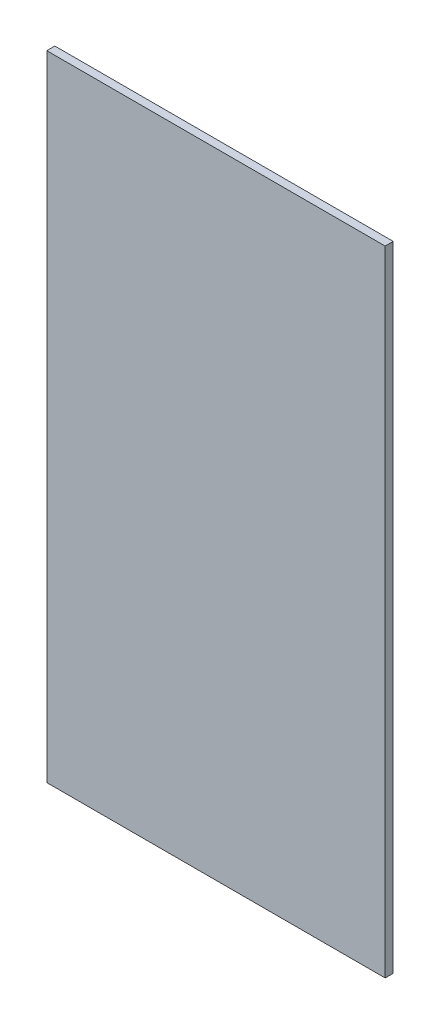
ISO-10303-21;
HEADER;
FILE_DESCRIPTION(('STEP AP214'),'2;1');
FILE_NAME('part.step','',(''),(''),'','','');
FILE_SCHEMA(('AUTOMOTIVE_DESIGN { 1 0 10303 214 1 1 1 1 }'));
ENDSEC;
DATA;
#1=APPLICATION_CONTEXT('core data for automotive mechanical design processes');
#2=APPLICATION_PROTOCOL_DEFINITION('international standard','automotive_design',2000,#1);
#3=PRODUCT_CONTEXT('',#1,'mechanical');
#4=PRODUCT('Part','Part','',(#3));
#5=PRODUCT_RELATED_PRODUCT_CATEGORY('part','',(#4));
#6=PRODUCT_DEFINITION_FORMATION('','',#4);
#7=PRODUCT_DEFINITION_CONTEXT('part definition',#1,'design');
#8=PRODUCT_DEFINITION('design','',#6,#7);
#9=PRODUCT_DEFINITION_SHAPE('','',#8);
#10=(LENGTH_UNIT() NAMED_UNIT(*) SI_UNIT(.MILLI.,.METRE.));
#11=(NAMED_UNIT(*) PLANE_ANGLE_UNIT() SI_UNIT($,.RADIAN.));
#12=(NAMED_UNIT(*) SI_UNIT($,.STERADIAN.) SOLID_ANGLE_UNIT());
#13=UNCERTAINTY_MEASURE_WITH_UNIT(LENGTH_MEASURE(1.E-05),#10,'distance_accuracy_value','');
#14=(GEOMETRIC_REPRESENTATION_CONTEXT(3) GLOBAL_UNCERTAINTY_ASSIGNED_CONTEXT((#13)) GLOBAL_UNIT_ASSIGNED_CONTEXT((#10,
#11,#12)) REPRESENTATION_CONTEXT('',''));
#15=CARTESIAN_POINT('',(0.,0.,0.));
#16=DIRECTION('',(0.,0.,1.));
#17=DIRECTION('',(1.,0.,0.));
#18=AXIS2_PLACEMENT_3D('',#15,#16,#17);
#19=CARTESIAN_POINT('',(61.5,116.5,1.5));
#20=DIRECTION('',(-1.,0.,0.));
#21=DIRECTION('',(0.,0.,1.));
#22=AXIS2_PLACEMENT_3D('',#19,#20,#21);
#23=PLANE('',#22);
#24=DIRECTION('',(0.,1.,0.));
#25=VECTOR('',#24,1.);
#26=CARTESIAN_POINT('',(61.5,116.5,0.));
#27=LINE('',#26,#25);
#28=CARTESIAN_POINT('',(61.5,-1.5,0.));
#29=VERTEX_POINT('',#28);
#30=CARTESIAN_POINT('',(61.5,116.5,0.));
#31=VERTEX_POINT('',#30);
#32=EDGE_CURVE('E96',#29,#31,#27,.T.);
#33=ORIENTED_EDGE('',*,*,#32,.T.);
#34=DIRECTION('',(0.,0.,-1.));
#35=VECTOR('',#34,1.);
#36=CARTESIAN_POINT('',(61.5,116.5,1.5));
#37=LINE('',#36,#35);
#38=CARTESIAN_POINT('',(61.5,116.5,1.5));
#39=VERTEX_POINT('',#38);
#40=EDGE_CURVE('E11',#39,#31,#37,.T.);
#41=ORIENTED_EDGE('',*,*,#40,.F.);
#42=DIRECTION('',(0.,1.,0.));
#43=VECTOR('',#42,1.);
#44=CARTESIAN_POINT('',(61.5,116.5,1.5));
#45=LINE('',#44,#43);
#46=CARTESIAN_POINT('',(61.5,-1.5,1.5));
#47=VERTEX_POINT('',#46);
#48=EDGE_CURVE('E84',#47,#39,#45,.T.);
#49=ORIENTED_EDGE('',*,*,#48,.F.);
#50=DIRECTION('',(0.,0.,-1.));
#51=VECTOR('',#50,1.);
#52=CARTESIAN_POINT('',(61.5,-1.5,1.5));
#53=LINE('',#52,#51);
#54=EDGE_CURVE('E92',#47,#29,#53,.T.);
#55=ORIENTED_EDGE('',*,*,#54,.T.);
#56=EDGE_LOOP('',(#33,#41,#49,#55));
#57=FACE_BOUND('',#56,.T.);
#58=ADVANCED_FACE('F33',(#57),#23,.F.);
#59=CARTESIAN_POINT('',(61.5,116.5,1.5));
#60=DIRECTION('',(0.,-1.,0.));
#61=DIRECTION('',(0.,0.,-1.));
#62=AXIS2_PLACEMENT_3D('',#59,#60,#61);
#63=PLANE('',#62);
#64=DIRECTION('',(-1.,0.,0.));
#65=VECTOR('',#64,1.);
#66=CARTESIAN_POINT('',(61.5,116.5,0.));
#67=LINE('',#66,#65);
#68=CARTESIAN_POINT('',(-1.5,116.5,0.));
#69=VERTEX_POINT('',#68);
#70=EDGE_CURVE('E88',#31,#69,#67,.T.);
#71=ORIENTED_EDGE('',*,*,#70,.T.);
#72=DIRECTION('',(0.,0.,-1.));
#73=VECTOR('',#72,1.);
#74=CARTESIAN_POINT('',(-1.5,116.5,1.5));
#75=LINE('',#74,#73);
#76=CARTESIAN_POINT('',(-1.5,116.5,1.5));
#77=VERTEX_POINT('',#76);
#78=EDGE_CURVE('E41',#77,#69,#75,.T.);
#79=ORIENTED_EDGE('',*,*,#78,.F.);
#80=DIRECTION('',(-1.,0.,0.));
#81=VECTOR('',#80,1.);
#82=CARTESIAN_POINT('',(61.5,116.5,1.5));
#83=LINE('',#82,#81);
#84=EDGE_CURVE('E79',#39,#77,#83,.T.);
#85=ORIENTED_EDGE('',*,*,#84,.F.);
#86=ORIENTED_EDGE('',*,*,#40,.T.);
#87=EDGE_LOOP('',(#71,#79,#85,#86));
#88=FACE_BOUND('',#87,.T.);
#89=ADVANCED_FACE('F87',(#88),#63,.F.);
#90=CARTESIAN_POINT('',(-1.5,116.5,1.5));
#91=DIRECTION('',(1.,0.,0.));
#92=DIRECTION('',(0.,0.,-1.));
#93=AXIS2_PLACEMENT_3D('',#90,#91,#92);
#94=PLANE('',#93);
#95=DIRECTION('',(0.,-1.,0.));
#96=VECTOR('',#95,1.);
#97=CARTESIAN_POINT('',(-1.5,116.5,0.));
#98=LINE('',#97,#96);
#99=CARTESIAN_POINT('',(-1.5,-1.5,0.));
#100=VERTEX_POINT('',#99);
#101=EDGE_CURVE('E66',#69,#100,#98,.T.);
#102=ORIENTED_EDGE('',*,*,#101,.T.);
#103=DIRECTION('',(0.,0.,-1.));
#104=VECTOR('',#103,1.);
#105=CARTESIAN_POINT('',(-1.5,-1.5,1.5));
#106=LINE('',#105,#104);
#107=CARTESIAN_POINT('',(-1.5,-1.5,1.5));
#108=VERTEX_POINT('',#107);
#109=EDGE_CURVE('E89',#108,#100,#106,.T.);
#110=ORIENTED_EDGE('',*,*,#109,.F.);
#111=DIRECTION('',(0.,-1.,0.));
#112=VECTOR('',#111,1.);
#113=CARTESIAN_POINT('',(-1.5,116.5,1.5));
#114=LINE('',#113,#112);
#115=EDGE_CURVE('E82',#77,#108,#114,.T.);
#116=ORIENTED_EDGE('',*,*,#115,.F.);
#117=ORIENTED_EDGE('',*,*,#78,.T.);
#118=EDGE_LOOP('',(#102,#110,#116,#117));
#119=FACE_BOUND('',#118,.T.);
#120=ADVANCED_FACE('F90',(#119),#94,.F.);
#121=CARTESIAN_POINT('',(61.5,-1.5,1.5));
#122=DIRECTION('',(0.,1.,0.));
#123=DIRECTION('',(0.,0.,1.));
#124=AXIS2_PLACEMENT_3D('',#121,#122,#123);
#125=PLANE('',#124);
#126=DIRECTION('',(1.,0.,0.));
#127=VECTOR('',#126,1.);
#128=CARTESIAN_POINT('',(61.5,-1.5,0.));
#129=LINE('',#128,#127);
#130=EDGE_CURVE('E72',#100,#29,#129,.T.);
#131=ORIENTED_EDGE('',*,*,#130,.T.);
#132=ORIENTED_EDGE('',*,*,#54,.F.);
#133=DIRECTION('',(1.,0.,0.));
#134=VECTOR('',#133,1.);
#135=CARTESIAN_POINT('',(61.5,-1.5,1.5));
#136=LINE('',#135,#134);
#137=EDGE_CURVE('E49',#108,#47,#136,.T.);
#138=ORIENTED_EDGE('',*,*,#137,.F.);
#139=ORIENTED_EDGE('',*,*,#109,.T.);
#140=EDGE_LOOP('',(#131,#132,#138,#139));
#141=FACE_BOUND('',#140,.T.);
#142=ADVANCED_FACE('F103',(#141),#125,.F.);
#143=CARTESIAN_POINT('',(0.,0.,1.5));
#144=DIRECTION('',(0.,0.,-1.));
#145=DIRECTION('',(-1.,0.,0.));
#146=AXIS2_PLACEMENT_3D('',#143,#144,#145);
#147=PLANE('',#146);
#148=ORIENTED_EDGE('',*,*,#48,.T.);
#149=ORIENTED_EDGE('',*,*,#84,.T.);
#150=ORIENTED_EDGE('',*,*,#115,.T.);
#151=ORIENTED_EDGE('',*,*,#137,.T.);
#152=EDGE_LOOP('',(#148,#149,#150,#151));
#153=FACE_BOUND('',#152,.T.);
#154=ADVANCED_FACE('F80',(#153),#147,.F.);
#155=CARTESIAN_POINT('',(0.,0.,0.));
#156=DIRECTION('',(0.,0.,-1.));
#157=DIRECTION('',(-1.,0.,0.));
#158=AXIS2_PLACEMENT_3D('',#155,#156,#157);
#159=PLANE('',#158);
#160=ORIENTED_EDGE('',*,*,#32,.F.);
#161=ORIENTED_EDGE('',*,*,#130,.F.);
#162=ORIENTED_EDGE('',*,*,#101,.F.);
#163=ORIENTED_EDGE('',*,*,#70,.F.);
#164=EDGE_LOOP('',(#160,#161,#162,#163));
#165=FACE_BOUND('',#164,.T.);
#166=ADVANCED_FACE('F106',(#165),#159,.T.);
#167=CLOSED_SHELL('',(#58,#89,#120,#142,#154,#166));
#168=MANIFOLD_SOLID_BREP('B2',#167);
#169=ADVANCED_BREP_SHAPE_REPRESENTATION('',(#18,#168),#14);
#170=SHAPE_DEFINITION_REPRESENTATION(#9,#169);
ENDSEC;
END-ISO-10303-21;
